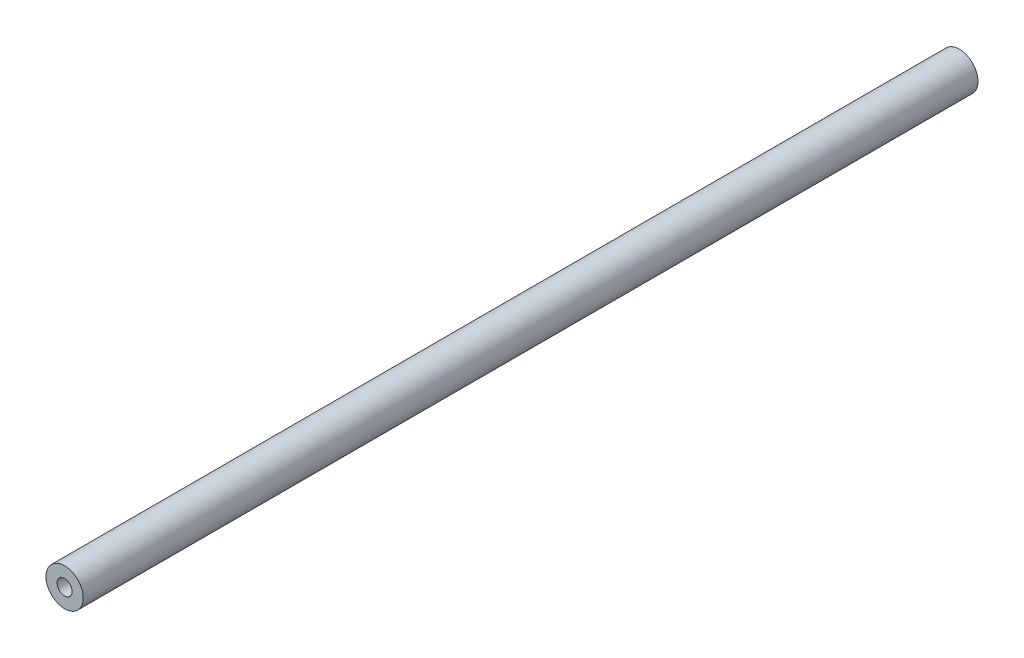
ISO-10303-21;
HEADER;
FILE_DESCRIPTION(('STEP AP214'),'2;1');
FILE_NAME('part.step','',(''),(''),'','','');
FILE_SCHEMA(('AUTOMOTIVE_DESIGN { 1 0 10303 214 1 1 1 1 }'));
ENDSEC;
DATA;
#1=APPLICATION_CONTEXT('core data for automotive mechanical design processes');
#2=APPLICATION_PROTOCOL_DEFINITION('international standard','automotive_design',2000,#1);
#3=PRODUCT_CONTEXT('',#1,'mechanical');
#4=PRODUCT('Part','Part','',(#3));
#5=PRODUCT_RELATED_PRODUCT_CATEGORY('part','',(#4));
#6=PRODUCT_DEFINITION_FORMATION('','',#4);
#7=PRODUCT_DEFINITION_CONTEXT('part definition',#1,'design');
#8=PRODUCT_DEFINITION('design','',#6,#7);
#9=PRODUCT_DEFINITION_SHAPE('','',#8);
#10=(LENGTH_UNIT() NAMED_UNIT(*) SI_UNIT(.MILLI.,.METRE.));
#11=(NAMED_UNIT(*) PLANE_ANGLE_UNIT() SI_UNIT($,.RADIAN.));
#12=(NAMED_UNIT(*) SI_UNIT($,.STERADIAN.) SOLID_ANGLE_UNIT());
#13=UNCERTAINTY_MEASURE_WITH_UNIT(LENGTH_MEASURE(1.E-05),#10,'distance_accuracy_value','');
#14=(GEOMETRIC_REPRESENTATION_CONTEXT(3) GLOBAL_UNCERTAINTY_ASSIGNED_CONTEXT((#13)) GLOBAL_UNIT_ASSIGNED_CONTEXT((#10,
#11,#12)) REPRESENTATION_CONTEXT('',''));
#15=CARTESIAN_POINT('',(0.,0.,0.));
#16=DIRECTION('',(0.,0.,1.));
#17=DIRECTION('',(1.,0.,0.));
#18=AXIS2_PLACEMENT_3D('',#15,#16,#17);
#19=CARTESIAN_POINT('',(0.,0.,152.4));
#20=DIRECTION('',(0.,0.,-1.));
#21=DIRECTION('',(-1.,0.,0.));
#22=AXIS2_PLACEMENT_3D('',#19,#20,#21);
#23=CYLINDRICAL_SURFACE('',#22,6.34999999999999);
#24=CARTESIAN_POINT('',(0.,0.,152.4));
#25=DIRECTION('',(0.,0.,1.));
#26=DIRECTION('',(1.,0.,0.));
#27=AXIS2_PLACEMENT_3D('',#24,#25,#26);
#28=CIRCLE('',#27,6.34999999999999);
#29=CARTESIAN_POINT('',(6.34999999999999,0.,152.4));
#30=VERTEX_POINT('',#29);
#31=EDGE_CURVE('E11',#30,#30,#28,.T.);
#32=ORIENTED_EDGE('',*,*,#31,.F.);
#33=EDGE_LOOP('',(#32));
#34=FACE_BOUND('',#33,.T.);
#35=CARTESIAN_POINT('',(0.,0.,-152.4));
#36=DIRECTION('',(0.,0.,1.));
#37=DIRECTION('',(1.,0.,0.));
#38=AXIS2_PLACEMENT_3D('',#35,#36,#37);
#39=CIRCLE('',#38,6.34999999999999);
#40=CARTESIAN_POINT('',(6.34999999999999,0.,-152.4));
#41=VERTEX_POINT('',#40);
#42=EDGE_CURVE('E49',#41,#41,#39,.T.);
#43=ORIENTED_EDGE('',*,*,#42,.T.);
#44=EDGE_LOOP('',(#43));
#45=FACE_BOUND('',#44,.T.);
#46=ADVANCED_FACE('F41',(#34,#45),#23,.T.);
#47=CARTESIAN_POINT('',(0.,0.,152.4));
#48=DIRECTION('',(0.,0.,1.));
#49=DIRECTION('',(1.,0.,0.));
#50=AXIS2_PLACEMENT_3D('',#47,#48,#49);
#51=PLANE('',#50);
#52=CARTESIAN_POINT('',(0.,0.,152.4));
#53=DIRECTION('',(0.,0.,1.));
#54=DIRECTION('',(1.,0.,0.));
#55=AXIS2_PLACEMENT_3D('',#52,#53,#54);
#56=CIRCLE('',#55,2.55269999999999);
#57=CARTESIAN_POINT('',(2.55269999999999,0.,152.4));
#58=VERTEX_POINT('',#57);
#59=EDGE_CURVE('E67',#58,#58,#56,.T.);
#60=ORIENTED_EDGE('',*,*,#59,.F.);
#61=EDGE_LOOP('',(#60));
#62=FACE_BOUND('',#61,.T.);
#63=ORIENTED_EDGE('',*,*,#31,.T.);
#64=EDGE_LOOP('',(#63));
#65=FACE_BOUND('',#64,.T.);
#66=ADVANCED_FACE('F87',(#62,#65),#51,.T.);
#67=CARTESIAN_POINT('',(0.,0.,-152.4));
#68=DIRECTION('',(0.,0.,1.));
#69=DIRECTION('',(1.,0.,0.));
#70=AXIS2_PLACEMENT_3D('',#67,#68,#69);
#71=PLANE('',#70);
#72=CARTESIAN_POINT('',(0.,0.,-152.4));
#73=DIRECTION('',(0.,0.,-1.));
#74=DIRECTION('',(-1.,0.,0.));
#75=AXIS2_PLACEMENT_3D('',#72,#73,#74);
#76=CIRCLE('',#75,2.55269999999999);
#77=CARTESIAN_POINT('',(-2.55269999999999,0.,-152.4));
#78=VERTEX_POINT('',#77);
#79=EDGE_CURVE('E66',#78,#78,#76,.T.);
#80=ORIENTED_EDGE('',*,*,#79,.F.);
#81=EDGE_LOOP('',(#80));
#82=FACE_BOUND('',#81,.T.);
#83=ORIENTED_EDGE('',*,*,#42,.F.);
#84=EDGE_LOOP('',(#83));
#85=FACE_BOUND('',#84,.T.);
#86=ADVANCED_FACE('F84',(#82,#85),#71,.F.);
#87=CARTESIAN_POINT('',(0.,0.,-127.));
#88=DIRECTION('',(0.,0.,-1.));
#89=DIRECTION('',(-1.,0.,0.));
#90=AXIS2_PLACEMENT_3D('',#87,#88,#89);
#91=CONICAL_SURFACE('',#90,2.55269999999999,1.02974425867665);
#92=CARTESIAN_POINT('',(0.,0.,-125.466183097808));
#93=VERTEX_POINT('',#92);
#94=VERTEX_LOOP('',#93);
#95=FACE_BOUND('',#94,.T.);
#96=CARTESIAN_POINT('',(0.,0.,-127.));
#97=DIRECTION('',(0.,0.,-1.));
#98=DIRECTION('',(-1.,0.,0.));
#99=AXIS2_PLACEMENT_3D('',#96,#97,#98);
#100=CIRCLE('',#99,2.55269999999999);
#101=CARTESIAN_POINT('',(-2.55269999999999,0.,-127.));
#102=VERTEX_POINT('',#101);
#103=EDGE_CURVE('E72',#102,#102,#100,.T.);
#104=ORIENTED_EDGE('',*,*,#103,.T.);
#105=EDGE_LOOP('',(#104));
#106=FACE_BOUND('',#105,.T.);
#107=ADVANCED_FACE('F86',(#95,#106),#91,.F.);
#108=CARTESIAN_POINT('',(0.,0.,-152.4));
#109=DIRECTION('',(0.,0.,-1.));
#110=DIRECTION('',(-1.,0.,0.));
#111=AXIS2_PLACEMENT_3D('',#108,#109,#110);
#112=CYLINDRICAL_SURFACE('',#111,2.55269999999999);
#113=ORIENTED_EDGE('',*,*,#103,.F.);
#114=EDGE_LOOP('',(#113));
#115=FACE_BOUND('',#114,.T.);
#116=ORIENTED_EDGE('',*,*,#79,.T.);
#117=EDGE_LOOP('',(#116));
#118=FACE_BOUND('',#117,.T.);
#119=ADVANCED_FACE('F59',(#115,#118),#112,.F.);
#120=CARTESIAN_POINT('',(0.,0.,127.));
#121=DIRECTION('',(0.,0.,1.));
#122=DIRECTION('',(1.,0.,0.));
#123=AXIS2_PLACEMENT_3D('',#120,#121,#122);
#124=CONICAL_SURFACE('',#123,2.55269999999999,1.02974425867665);
#125=CARTESIAN_POINT('',(0.,0.,125.466183097808));
#126=VERTEX_POINT('',#125);
#127=VERTEX_LOOP('',#126);
#128=FACE_BOUND('',#127,.T.);
#129=CARTESIAN_POINT('',(0.,0.,127.));
#130=DIRECTION('',(0.,0.,1.));
#131=DIRECTION('',(1.,0.,0.));
#132=AXIS2_PLACEMENT_3D('',#129,#130,#131);
#133=CIRCLE('',#132,2.55269999999999);
#134=CARTESIAN_POINT('',(2.55269999999999,0.,127.));
#135=VERTEX_POINT('',#134);
#136=EDGE_CURVE('E63',#135,#135,#133,.T.);
#137=ORIENTED_EDGE('',*,*,#136,.T.);
#138=EDGE_LOOP('',(#137));
#139=FACE_BOUND('',#138,.T.);
#140=ADVANCED_FACE('F55',(#128,#139),#124,.F.);
#141=CARTESIAN_POINT('',(0.,0.,152.4));
#142=DIRECTION('',(0.,0.,1.));
#143=DIRECTION('',(1.,0.,0.));
#144=AXIS2_PLACEMENT_3D('',#141,#142,#143);
#145=CYLINDRICAL_SURFACE('',#144,2.55269999999999);
#146=ORIENTED_EDGE('',*,*,#136,.F.);
#147=EDGE_LOOP('',(#146));
#148=FACE_BOUND('',#147,.T.);
#149=ORIENTED_EDGE('',*,*,#59,.T.);
#150=EDGE_LOOP('',(#149));
#151=FACE_BOUND('',#150,.T.);
#152=ADVANCED_FACE('F58',(#148,#151),#145,.F.);
#153=CLOSED_SHELL('',(#46,#66,#86,#107,#119,#140,#152));
#154=MANIFOLD_SOLID_BREP('B2',#153);
#155=ADVANCED_BREP_SHAPE_REPRESENTATION('',(#18,#154),#14);
#156=SHAPE_DEFINITION_REPRESENTATION(#9,#155);
ENDSEC;
END-ISO-10303-21;
